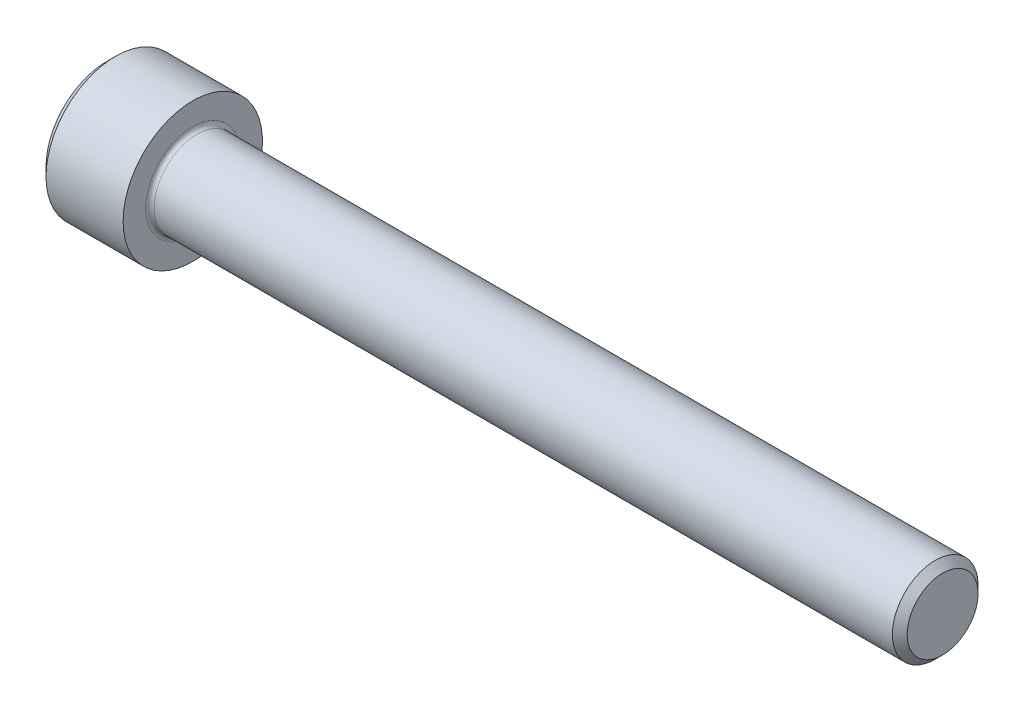
ISO-10303-21;
HEADER;
FILE_DESCRIPTION(('STEP AP214'),'2;1');
FILE_NAME('part.step','',(''),(''),'','','');
FILE_SCHEMA(('AUTOMOTIVE_DESIGN { 1 0 10303 214 1 1 1 1 }'));
ENDSEC;
DATA;
#1=APPLICATION_CONTEXT('core data for automotive mechanical design processes');
#2=APPLICATION_PROTOCOL_DEFINITION('international standard','automotive_design',2000,#1);
#3=PRODUCT_CONTEXT('',#1,'mechanical');
#4=PRODUCT('Part','Part','',(#3));
#5=PRODUCT_RELATED_PRODUCT_CATEGORY('part','',(#4));
#6=PRODUCT_DEFINITION_FORMATION('','',#4);
#7=PRODUCT_DEFINITION_CONTEXT('part definition',#1,'design');
#8=PRODUCT_DEFINITION('design','',#6,#7);
#9=PRODUCT_DEFINITION_SHAPE('','',#8);
#10=(LENGTH_UNIT() NAMED_UNIT(*) SI_UNIT(.MILLI.,.METRE.));
#11=(NAMED_UNIT(*) PLANE_ANGLE_UNIT() SI_UNIT($,.RADIAN.));
#12=(NAMED_UNIT(*) SI_UNIT($,.STERADIAN.) SOLID_ANGLE_UNIT());
#13=UNCERTAINTY_MEASURE_WITH_UNIT(LENGTH_MEASURE(1.E-05),#10,'distance_accuracy_value','');
#14=(GEOMETRIC_REPRESENTATION_CONTEXT(3) GLOBAL_UNCERTAINTY_ASSIGNED_CONTEXT((#13)) GLOBAL_UNIT_ASSIGNED_CONTEXT((#10,
#11,#12)) REPRESENTATION_CONTEXT('',''));
#15=CARTESIAN_POINT('',(0.,0.,0.));
#16=DIRECTION('',(0.,0.,1.));
#17=DIRECTION('',(1.,0.,0.));
#18=AXIS2_PLACEMENT_3D('',#15,#16,#17);
#19=CARTESIAN_POINT('',(0.,0.,0.));
#20=DIRECTION('',(-1.,0.,0.));
#21=DIRECTION('',(0.,0.,1.));
#22=AXIS2_PLACEMENT_3D('',#19,#20,#21);
#23=PLANE('',#22);
#24=DIRECTION('',(0.,-0.499999999999999,0.866025403784439));
#25=VECTOR('',#24,1.);
#26=CARTESIAN_POINT('',(0.,3.51894989071077,0.));
#27=LINE('',#26,#25);
#28=CARTESIAN_POINT('',(0.,3.51894989071077,0.));
#29=VERTEX_POINT('',#28);
#30=CARTESIAN_POINT('',(0.,1.75947494535539,3.0475));
#31=VERTEX_POINT('',#30);
#32=EDGE_CURVE('E274',#29,#31,#27,.T.);
#33=ORIENTED_EDGE('',*,*,#32,.T.);
#34=DIRECTION('',(0.,1.,0.));
#35=VECTOR('',#34,1.);
#36=CARTESIAN_POINT('',(0.,-1.75947494535538,3.0475));
#37=LINE('',#36,#35);
#38=CARTESIAN_POINT('',(0.,-1.75947494535538,3.0475));
#39=VERTEX_POINT('',#38);
#40=EDGE_CURVE('E133',#39,#31,#37,.T.);
#41=ORIENTED_EDGE('',*,*,#40,.F.);
#42=DIRECTION('',(0.,-0.500000000000001,-0.866025403784438));
#43=VECTOR('',#42,1.);
#44=CARTESIAN_POINT('',(0.,-1.75947494535538,3.0475));
#45=LINE('',#44,#43);
#46=CARTESIAN_POINT('',(0.,-3.51894989071077,0.));
#47=VERTEX_POINT('',#46);
#48=EDGE_CURVE('E277',#39,#47,#45,.T.);
#49=ORIENTED_EDGE('',*,*,#48,.T.);
#50=DIRECTION('',(0.,0.499999999999999,-0.866025403784439));
#51=VECTOR('',#50,1.);
#52=CARTESIAN_POINT('',(0.,-3.51894989071077,0.));
#53=LINE('',#52,#51);
#54=CARTESIAN_POINT('',(0.,-1.75947494535539,-3.0475));
#55=VERTEX_POINT('',#54);
#56=EDGE_CURVE('E280',#47,#55,#53,.T.);
#57=ORIENTED_EDGE('',*,*,#56,.T.);
#58=DIRECTION('',(0.,-1.,0.));
#59=VECTOR('',#58,1.);
#60=CARTESIAN_POINT('',(0.,1.75947494535538,-3.0475));
#61=LINE('',#60,#59);
#62=CARTESIAN_POINT('',(0.,1.75947494535538,-3.0475));
#63=VERTEX_POINT('',#62);
#64=EDGE_CURVE('E283',#63,#55,#61,.T.);
#65=ORIENTED_EDGE('',*,*,#64,.F.);
#66=DIRECTION('',(0.,-0.500000000000001,-0.866025403784438));
#67=VECTOR('',#66,1.);
#68=CARTESIAN_POINT('',(0.,3.51894989071077,0.));
#69=LINE('',#68,#67);
#70=EDGE_CURVE('E128',#29,#63,#69,.T.);
#71=ORIENTED_EDGE('',*,*,#70,.F.);
#72=EDGE_LOOP('',(#33,#41,#49,#57,#65,#71));
#73=FACE_BOUND('',#72,.T.);
#74=CARTESIAN_POINT('',(0.,0.,0.));
#75=DIRECTION('',(-1.,0.,0.));
#76=DIRECTION('',(0.,0.,1.));
#77=AXIS2_PLACEMENT_3D('',#74,#75,#76);
#78=CIRCLE('',#77,5.7);
#79=CARTESIAN_POINT('',(0.,0.,5.7));
#80=VERTEX_POINT('',#79);
#81=EDGE_CURVE('E157',#80,#80,#78,.T.);
#82=ORIENTED_EDGE('',*,*,#81,.T.);
#83=EDGE_LOOP('',(#82));
#84=FACE_BOUND('',#83,.T.);
#85=ADVANCED_FACE('F41',(#73,#84),#23,.T.);
#86=CARTESIAN_POINT('',(0.,0.,0.));
#87=DIRECTION('',(1.,0.,0.));
#88=DIRECTION('',(0.,0.,-1.));
#89=AXIS2_PLACEMENT_3D('',#86,#87,#88);
#90=CONICAL_SURFACE('',#89,5.7,0.785398163397448);
#91=CARTESIAN_POINT('',(0.800000000000002,0.,0.));
#92=DIRECTION('',(-1.,0.,0.));
#93=DIRECTION('',(0.,0.,1.));
#94=AXIS2_PLACEMENT_3D('',#91,#92,#93);
#95=CIRCLE('',#94,6.5);
#96=CARTESIAN_POINT('',(0.800000000000002,0.,6.5));
#97=VERTEX_POINT('',#96);
#98=EDGE_CURVE('E154',#97,#97,#95,.T.);
#99=ORIENTED_EDGE('',*,*,#98,.T.);
#100=EDGE_LOOP('',(#99));
#101=FACE_BOUND('',#100,.T.);
#102=ORIENTED_EDGE('',*,*,#81,.F.);
#103=EDGE_LOOP('',(#102));
#104=FACE_BOUND('',#103,.T.);
#105=ADVANCED_FACE('F179',(#101,#104),#90,.T.);
#106=CARTESIAN_POINT('',(-31.75,0.,0.));
#107=DIRECTION('',(-1.,0.,0.));
#108=DIRECTION('',(0.,0.,1.));
#109=AXIS2_PLACEMENT_3D('',#106,#107,#108);
#110=CYLINDRICAL_SURFACE('',#109,6.5);
#111=CARTESIAN_POINT('',(7.99999999999999,0.,0.));
#112=DIRECTION('',(-1.,0.,0.));
#113=DIRECTION('',(0.,0.,1.));
#114=AXIS2_PLACEMENT_3D('',#111,#112,#113);
#115=CIRCLE('',#114,6.5);
#116=CARTESIAN_POINT('',(7.99999999999999,0.,6.5));
#117=VERTEX_POINT('',#116);
#118=EDGE_CURVE('E151',#117,#117,#115,.T.);
#119=ORIENTED_EDGE('',*,*,#118,.T.);
#120=EDGE_LOOP('',(#119));
#121=FACE_BOUND('',#120,.T.);
#122=ORIENTED_EDGE('',*,*,#98,.F.);
#123=EDGE_LOOP('',(#122));
#124=FACE_BOUND('',#123,.T.);
#125=ADVANCED_FACE('F184',(#121,#124),#110,.T.);
#126=CARTESIAN_POINT('',(7.99999999999999,6.5,0.));
#127=DIRECTION('',(1.,0.,0.));
#128=DIRECTION('',(0.,0.,-1.));
#129=AXIS2_PLACEMENT_3D('',#126,#127,#128);
#130=PLANE('',#129);
#131=CARTESIAN_POINT('',(7.99999999999999,0.,0.));
#132=DIRECTION('',(1.,0.,0.));
#133=DIRECTION('',(0.,0.,-1.));
#134=AXIS2_PLACEMENT_3D('',#131,#132,#133);
#135=CIRCLE('',#134,4.4);
#136=CARTESIAN_POINT('',(7.99999999999999,0.,-4.4));
#137=VERTEX_POINT('',#136);
#138=EDGE_CURVE('E49',#137,#137,#135,.F.);
#139=ORIENTED_EDGE('',*,*,#138,.T.);
#140=EDGE_LOOP('',(#139));
#141=FACE_BOUND('',#140,.T.);
#142=ORIENTED_EDGE('',*,*,#118,.F.);
#143=EDGE_LOOP('',(#142));
#144=FACE_BOUND('',#143,.T.);
#145=ADVANCED_FACE('F162',(#141,#144),#130,.T.);
#146=CARTESIAN_POINT('',(-31.75,0.,0.));
#147=DIRECTION('',(-1.,0.,0.));
#148=DIRECTION('',(0.,0.,1.));
#149=AXIS2_PLACEMENT_3D('',#146,#147,#148);
#150=CYLINDRICAL_SURFACE('',#149,4.);
#151=CARTESIAN_POINT('',(8.39999999999999,0.,0.));
#152=DIRECTION('',(1.,0.,0.));
#153=DIRECTION('',(0.,0.,-1.));
#154=AXIS2_PLACEMENT_3D('',#151,#152,#153);
#155=CIRCLE('',#154,4.);
#156=CARTESIAN_POINT('',(8.39999999999999,0.,-4.));
#157=VERTEX_POINT('',#156);
#158=EDGE_CURVE('E11',#157,#157,#155,.T.);
#159=ORIENTED_EDGE('',*,*,#158,.T.);
#160=EDGE_LOOP('',(#159));
#161=FACE_BOUND('',#160,.T.);
#162=CARTESIAN_POINT('',(77.3095,0.,0.));
#163=DIRECTION('',(-1.,0.,0.));
#164=DIRECTION('',(0.,0.,1.));
#165=AXIS2_PLACEMENT_3D('',#162,#163,#164);
#166=CIRCLE('',#165,4.);
#167=CARTESIAN_POINT('',(77.3095,0.,4.));
#168=VERTEX_POINT('',#167);
#169=EDGE_CURVE('E148',#168,#168,#166,.T.);
#170=ORIENTED_EDGE('',*,*,#169,.T.);
#171=EDGE_LOOP('',(#170));
#172=FACE_BOUND('',#171,.T.);
#173=ADVANCED_FACE('F194',(#161,#172),#150,.T.);
#174=CARTESIAN_POINT('',(78.,0.,0.));
#175=DIRECTION('',(-1.,0.,0.));
#176=DIRECTION('',(0.,0.,1.));
#177=AXIS2_PLACEMENT_3D('',#174,#175,#176);
#178=CONICAL_SURFACE('',#177,3.3095,0.785398163397461);
#179=ORIENTED_EDGE('',*,*,#169,.F.);
#180=EDGE_LOOP('',(#179));
#181=FACE_BOUND('',#180,.T.);
#182=CARTESIAN_POINT('',(78.,0.,0.));
#183=DIRECTION('',(-1.,0.,0.));
#184=DIRECTION('',(0.,0.,1.));
#185=AXIS2_PLACEMENT_3D('',#182,#183,#184);
#186=CIRCLE('',#185,3.3095);
#187=CARTESIAN_POINT('',(78.,0.,3.3095));
#188=VERTEX_POINT('',#187);
#189=EDGE_CURVE('E144',#188,#188,#186,.T.);
#190=ORIENTED_EDGE('',*,*,#189,.T.);
#191=EDGE_LOOP('',(#190));
#192=FACE_BOUND('',#191,.T.);
#193=ADVANCED_FACE('F175',(#181,#192),#178,.T.);
#194=CARTESIAN_POINT('',(78.,3.3095,0.));
#195=DIRECTION('',(1.,0.,0.));
#196=DIRECTION('',(0.,0.,-1.));
#197=AXIS2_PLACEMENT_3D('',#194,#195,#196);
#198=PLANE('',#197);
#199=ORIENTED_EDGE('',*,*,#189,.F.);
#200=EDGE_LOOP('',(#199));
#201=FACE_BOUND('',#200,.T.);
#202=ADVANCED_FACE('F166',(#201),#198,.T.);
#203=CARTESIAN_POINT('',(8.39999999999999,0.,0.));
#204=DIRECTION('',(1.,0.,0.));
#205=DIRECTION('',(0.,0.,-1.));
#206=AXIS2_PLACEMENT_3D('',#203,#204,#205);
#207=TOROIDAL_SURFACE('',#206,4.4,0.4);
#208=ORIENTED_EDGE('',*,*,#158,.F.);
#209=EDGE_LOOP('',(#208));
#210=FACE_BOUND('',#209,.T.);
#211=ORIENTED_EDGE('',*,*,#138,.F.);
#212=EDGE_LOOP('',(#211));
#213=FACE_BOUND('',#212,.T.);
#214=ADVANCED_FACE('F43',(#210,#213),#207,.F.);
#215=CARTESIAN_POINT('',(4.,3.51894989071077,0.));
#216=DIRECTION('',(0.,-0.866025403784439,-0.499999999999999));
#217=DIRECTION('',(0.,0.499999999999999,-0.866025403784439));
#218=AXIS2_PLACEMENT_3D('',#215,#216,#217);
#219=PLANE('',#218);
#220=ORIENTED_EDGE('',*,*,#32,.F.);
#221=DIRECTION('',(-1.,0.,0.));
#222=VECTOR('',#221,1.);
#223=CARTESIAN_POINT('',(4.,3.51894989071077,0.));
#224=LINE('',#223,#222);
#225=CARTESIAN_POINT('',(4.,3.51894989071077,0.));
#226=VERTEX_POINT('',#225);
#227=EDGE_CURVE('E273',#226,#29,#224,.T.);
#228=ORIENTED_EDGE('',*,*,#227,.F.);
#229=DIRECTION('',(0.,-0.499999999999999,0.866025403784439));
#230=VECTOR('',#229,1.);
#231=CARTESIAN_POINT('',(4.,3.51894989071077,0.));
#232=LINE('',#231,#230);
#233=CARTESIAN_POINT('',(3.99999999999999,2.63921241803308,1.52375));
#234=VERTEX_POINT('',#233);
#235=EDGE_CURVE('E56',#226,#234,#232,.T.);
#236=ORIENTED_EDGE('',*,*,#235,.T.);
#237=CARTESIAN_POINT('',(4.,1.75947494535539,3.0475));
#238=VERTEX_POINT('',#237);
#239=EDGE_CURVE('E114',#234,#238,#232,.T.);
#240=ORIENTED_EDGE('',*,*,#239,.T.);
#241=DIRECTION('',(-1.,0.,0.));
#242=VECTOR('',#241,1.);
#243=CARTESIAN_POINT('',(4.,1.75947494535539,3.0475));
#244=LINE('',#243,#242);
#245=EDGE_CURVE('E126',#238,#31,#244,.T.);
#246=ORIENTED_EDGE('',*,*,#245,.T.);
#247=EDGE_LOOP('',(#220,#228,#236,#240,#246));
#248=FACE_BOUND('',#247,.T.);
#249=ADVANCED_FACE('F125',(#248),#219,.T.);
#250=CARTESIAN_POINT('',(4.,-1.75947494535538,3.0475));
#251=DIRECTION('',(0.,0.,1.));
#252=DIRECTION('',(0.,-1.,0.));
#253=AXIS2_PLACEMENT_3D('',#250,#251,#252);
#254=PLANE('',#253);
#255=ORIENTED_EDGE('',*,*,#40,.T.);
#256=ORIENTED_EDGE('',*,*,#245,.F.);
#257=DIRECTION('',(0.,1.,0.));
#258=VECTOR('',#257,1.);
#259=CARTESIAN_POINT('',(4.,-1.75947494535538,3.0475));
#260=LINE('',#259,#258);
#261=CARTESIAN_POINT('',(4.,0.,3.0475));
#262=VERTEX_POINT('',#261);
#263=EDGE_CURVE('E112',#262,#238,#260,.T.);
#264=ORIENTED_EDGE('',*,*,#263,.F.);
#265=CARTESIAN_POINT('',(4.,-1.75947494535538,3.0475));
#266=VERTEX_POINT('',#265);
#267=EDGE_CURVE('E122',#266,#262,#260,.T.);
#268=ORIENTED_EDGE('',*,*,#267,.F.);
#269=DIRECTION('',(-1.,0.,0.));
#270=VECTOR('',#269,1.);
#271=CARTESIAN_POINT('',(4.,-1.75947494535538,3.0475));
#272=LINE('',#271,#270);
#273=EDGE_CURVE('E135',#266,#39,#272,.T.);
#274=ORIENTED_EDGE('',*,*,#273,.T.);
#275=EDGE_LOOP('',(#255,#256,#264,#268,#274));
#276=FACE_BOUND('',#275,.T.);
#277=ADVANCED_FACE('F130',(#276),#254,.F.);
#278=CARTESIAN_POINT('',(4.,-1.75947494535538,3.0475));
#279=DIRECTION('',(0.,0.866025403784438,-0.500000000000001));
#280=DIRECTION('',(0.,0.500000000000001,0.866025403784438));
#281=AXIS2_PLACEMENT_3D('',#278,#279,#280);
#282=PLANE('',#281);
#283=ORIENTED_EDGE('',*,*,#48,.F.);
#284=ORIENTED_EDGE('',*,*,#273,.F.);
#285=DIRECTION('',(0.,-0.500000000000001,-0.866025403784438));
#286=VECTOR('',#285,1.);
#287=CARTESIAN_POINT('',(4.,-1.75947494535538,3.0475));
#288=LINE('',#287,#286);
#289=CARTESIAN_POINT('',(4.,-2.63921241803307,1.52375));
#290=VERTEX_POINT('',#289);
#291=EDGE_CURVE('E254',#266,#290,#288,.T.);
#292=ORIENTED_EDGE('',*,*,#291,.T.);
#293=CARTESIAN_POINT('',(4.,-3.51894989071077,0.));
#294=VERTEX_POINT('',#293);
#295=EDGE_CURVE('E256',#290,#294,#288,.T.);
#296=ORIENTED_EDGE('',*,*,#295,.T.);
#297=DIRECTION('',(-1.,0.,0.));
#298=VECTOR('',#297,1.);
#299=CARTESIAN_POINT('',(4.,-3.51894989071077,0.));
#300=LINE('',#299,#298);
#301=EDGE_CURVE('E140',#294,#47,#300,.T.);
#302=ORIENTED_EDGE('',*,*,#301,.T.);
#303=EDGE_LOOP('',(#283,#284,#292,#296,#302));
#304=FACE_BOUND('',#303,.T.);
#305=ADVANCED_FACE('F206',(#304),#282,.T.);
#306=CARTESIAN_POINT('',(4.,-3.51894989071077,0.));
#307=DIRECTION('',(0.,0.866025403784439,0.499999999999999));
#308=DIRECTION('',(0.,-0.499999999999999,0.866025403784439));
#309=AXIS2_PLACEMENT_3D('',#306,#307,#308);
#310=PLANE('',#309);
#311=ORIENTED_EDGE('',*,*,#56,.F.);
#312=ORIENTED_EDGE('',*,*,#301,.F.);
#313=DIRECTION('',(0.,0.499999999999999,-0.866025403784439));
#314=VECTOR('',#313,1.);
#315=CARTESIAN_POINT('',(4.,-3.51894989071077,0.));
#316=LINE('',#315,#314);
#317=CARTESIAN_POINT('',(4.,-2.63921241803308,-1.52375));
#318=VERTEX_POINT('',#317);
#319=EDGE_CURVE('E259',#294,#318,#316,.T.);
#320=ORIENTED_EDGE('',*,*,#319,.T.);
#321=CARTESIAN_POINT('',(4.,-1.75947494535539,-3.0475));
#322=VERTEX_POINT('',#321);
#323=EDGE_CURVE('E263',#318,#322,#316,.T.);
#324=ORIENTED_EDGE('',*,*,#323,.T.);
#325=DIRECTION('',(-1.,0.,0.));
#326=VECTOR('',#325,1.);
#327=CARTESIAN_POINT('',(4.,-1.75947494535539,-3.0475));
#328=LINE('',#327,#326);
#329=EDGE_CURVE('E292',#322,#55,#328,.T.);
#330=ORIENTED_EDGE('',*,*,#329,.T.);
#331=EDGE_LOOP('',(#311,#312,#320,#324,#330));
#332=FACE_BOUND('',#331,.T.);
#333=ADVANCED_FACE('F209',(#332),#310,.T.);
#334=CARTESIAN_POINT('',(4.,1.75947494535538,-3.0475));
#335=DIRECTION('',(0.,0.,-1.));
#336=DIRECTION('',(0.,1.,0.));
#337=AXIS2_PLACEMENT_3D('',#334,#335,#336);
#338=PLANE('',#337);
#339=ORIENTED_EDGE('',*,*,#64,.T.);
#340=ORIENTED_EDGE('',*,*,#329,.F.);
#341=DIRECTION('',(0.,-1.,0.));
#342=VECTOR('',#341,1.);
#343=CARTESIAN_POINT('',(4.,1.75947494535538,-3.0475));
#344=LINE('',#343,#342);
#345=CARTESIAN_POINT('',(4.,0.,-3.0475));
#346=VERTEX_POINT('',#345);
#347=EDGE_CURVE('E267',#346,#322,#344,.T.);
#348=ORIENTED_EDGE('',*,*,#347,.F.);
#349=CARTESIAN_POINT('',(4.,1.75947494535538,-3.0475));
#350=VERTEX_POINT('',#349);
#351=EDGE_CURVE('E268',#350,#346,#344,.T.);
#352=ORIENTED_EDGE('',*,*,#351,.F.);
#353=DIRECTION('',(-1.,0.,0.));
#354=VECTOR('',#353,1.);
#355=CARTESIAN_POINT('',(4.,1.75947494535538,-3.0475));
#356=LINE('',#355,#354);
#357=EDGE_CURVE('E289',#350,#63,#356,.T.);
#358=ORIENTED_EDGE('',*,*,#357,.T.);
#359=EDGE_LOOP('',(#339,#340,#348,#352,#358));
#360=FACE_BOUND('',#359,.T.);
#361=ADVANCED_FACE('F213',(#360),#338,.F.);
#362=CARTESIAN_POINT('',(4.,3.51894989071077,0.));
#363=DIRECTION('',(0.,0.866025403784438,-0.500000000000001));
#364=DIRECTION('',(0.,0.500000000000001,0.866025403784438));
#365=AXIS2_PLACEMENT_3D('',#362,#363,#364);
#366=PLANE('',#365);
#367=ORIENTED_EDGE('',*,*,#70,.T.);
#368=ORIENTED_EDGE('',*,*,#357,.F.);
#369=DIRECTION('',(0.,-0.500000000000001,-0.866025403784438));
#370=VECTOR('',#369,1.);
#371=CARTESIAN_POINT('',(4.,3.51894989071077,0.));
#372=LINE('',#371,#370);
#373=CARTESIAN_POINT('',(4.,2.63921241803308,-1.52375));
#374=VERTEX_POINT('',#373);
#375=EDGE_CURVE('E271',#374,#350,#372,.T.);
#376=ORIENTED_EDGE('',*,*,#375,.F.);
#377=EDGE_CURVE('E245',#226,#374,#372,.T.);
#378=ORIENTED_EDGE('',*,*,#377,.F.);
#379=ORIENTED_EDGE('',*,*,#227,.T.);
#380=EDGE_LOOP('',(#367,#368,#376,#378,#379));
#381=FACE_BOUND('',#380,.T.);
#382=ADVANCED_FACE('F217',(#381),#366,.F.);
#383=CARTESIAN_POINT('',(4.,1.75947494535539,3.0475));
#384=DIRECTION('',(-1.,0.,0.));
#385=DIRECTION('',(0.,0.,1.));
#386=AXIS2_PLACEMENT_3D('',#383,#384,#385);
#387=PLANE('',#386);
#388=CARTESIAN_POINT('',(3.99999999999999,0.,0.));
#389=DIRECTION('',(-1.,0.,0.));
#390=DIRECTION('',(0.,0.,1.));
#391=AXIS2_PLACEMENT_3D('',#388,#389,#390);
#392=CIRCLE('',#391,3.0475);
#393=EDGE_CURVE('E134',#290,#262,#392,.T.);
#394=ORIENTED_EDGE('',*,*,#393,.F.);
#395=ORIENTED_EDGE('',*,*,#291,.F.);
#396=ORIENTED_EDGE('',*,*,#267,.T.);
#397=EDGE_LOOP('',(#394,#395,#396));
#398=FACE_BOUND('',#397,.T.);
#399=ADVANCED_FACE('F221',(#398),#387,.T.);
#400=EDGE_CURVE('E138',#318,#290,#392,.T.);
#401=ORIENTED_EDGE('',*,*,#400,.F.);
#402=ORIENTED_EDGE('',*,*,#319,.F.);
#403=ORIENTED_EDGE('',*,*,#295,.F.);
#404=EDGE_LOOP('',(#401,#402,#403));
#405=FACE_BOUND('',#404,.T.);
#406=ADVANCED_FACE('F224',(#405),#387,.T.);
#407=EDGE_CURVE('E298',#346,#318,#392,.T.);
#408=ORIENTED_EDGE('',*,*,#407,.F.);
#409=ORIENTED_EDGE('',*,*,#347,.T.);
#410=ORIENTED_EDGE('',*,*,#323,.F.);
#411=EDGE_LOOP('',(#408,#409,#410));
#412=FACE_BOUND('',#411,.T.);
#413=ADVANCED_FACE('F229',(#412),#387,.T.);
#414=EDGE_CURVE('E248',#374,#346,#392,.T.);
#415=ORIENTED_EDGE('',*,*,#414,.F.);
#416=ORIENTED_EDGE('',*,*,#375,.T.);
#417=ORIENTED_EDGE('',*,*,#351,.T.);
#418=EDGE_LOOP('',(#415,#416,#417));
#419=FACE_BOUND('',#418,.T.);
#420=ADVANCED_FACE('F236',(#419),#387,.T.);
#421=EDGE_CURVE('E145',#234,#374,#392,.T.);
#422=ORIENTED_EDGE('',*,*,#421,.F.);
#423=ORIENTED_EDGE('',*,*,#235,.F.);
#424=ORIENTED_EDGE('',*,*,#377,.T.);
#425=EDGE_LOOP('',(#422,#423,#424));
#426=FACE_BOUND('',#425,.T.);
#427=ADVANCED_FACE('F232',(#426),#387,.T.);
#428=EDGE_CURVE('E117',#262,#234,#392,.T.);
#429=ORIENTED_EDGE('',*,*,#428,.F.);
#430=ORIENTED_EDGE('',*,*,#263,.T.);
#431=ORIENTED_EDGE('',*,*,#239,.F.);
#432=EDGE_LOOP('',(#429,#430,#431));
#433=FACE_BOUND('',#432,.T.);
#434=ADVANCED_FACE('F113',(#433),#387,.T.);
#435=CARTESIAN_POINT('',(3.99999999999999,0.,0.));
#436=DIRECTION('',(-1.,0.,0.));
#437=DIRECTION('',(0.,0.,1.));
#438=AXIS2_PLACEMENT_3D('',#435,#436,#437);
#439=CONICAL_SURFACE('',#438,3.0475,1.04719755119659);
#440=CARTESIAN_POINT('',(5.75947494535539,0.,0.));
#441=VERTEX_POINT('',#440);
#442=VERTEX_LOOP('',#441);
#443=FACE_BOUND('',#442,.T.);
#444=ORIENTED_EDGE('',*,*,#428,.T.);
#445=ORIENTED_EDGE('',*,*,#421,.T.);
#446=ORIENTED_EDGE('',*,*,#414,.T.);
#447=ORIENTED_EDGE('',*,*,#407,.T.);
#448=ORIENTED_EDGE('',*,*,#400,.T.);
#449=ORIENTED_EDGE('',*,*,#393,.T.);
#450=EDGE_LOOP('',(#444,#445,#446,#447,#448,#449));
#451=FACE_BOUND('',#450,.T.);
#452=ADVANCED_FACE('F201',(#443,#451),#439,.F.);
#453=CLOSED_SHELL('',(#85,#105,#125,#145,#173,#193,#202,#214,#249,#277,#305,#333,#361,#382,#399,
#406,#413,#420,#427,#434,#452));
#454=MANIFOLD_SOLID_BREP('B2',#453);
#455=ADVANCED_BREP_SHAPE_REPRESENTATION('',(#18,#454),#14);
#456=SHAPE_DEFINITION_REPRESENTATION(#9,#455);
ENDSEC;
END-ISO-10303-21;
